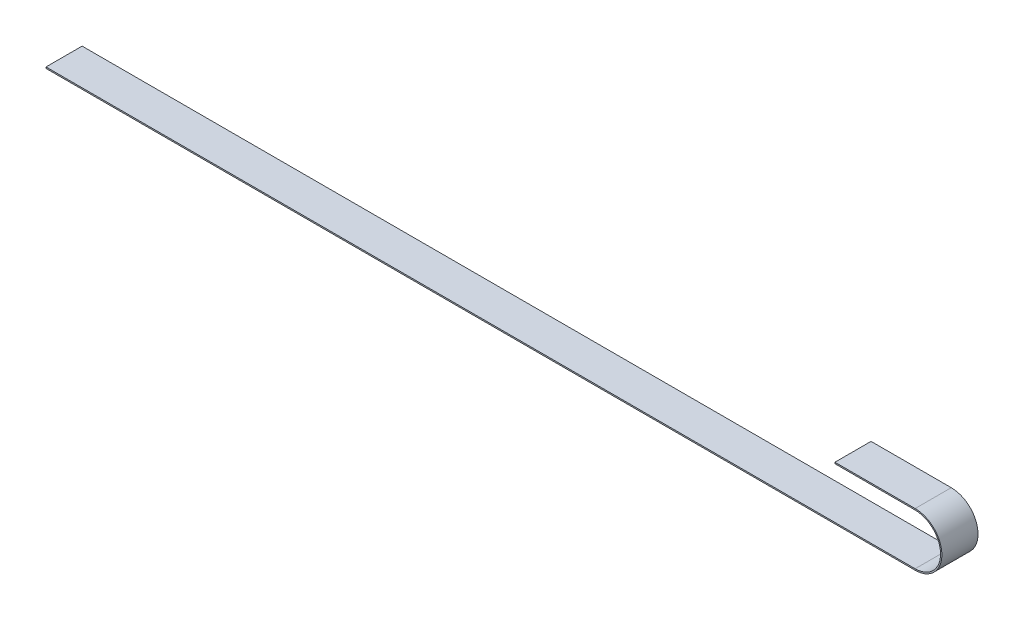
ISO-10303-21;
HEADER;
FILE_DESCRIPTION(('STEP AP214'),'2;1');
FILE_NAME('part.step','',(''),(''),'','','');
FILE_SCHEMA(('AUTOMOTIVE_DESIGN { 1 0 10303 214 1 1 1 1 }'));
ENDSEC;
DATA;
#1=APPLICATION_CONTEXT('core data for automotive mechanical design processes');
#2=APPLICATION_PROTOCOL_DEFINITION('international standard','automotive_design',2000,#1);
#3=PRODUCT_CONTEXT('',#1,'mechanical');
#4=PRODUCT('Part','Part','',(#3));
#5=PRODUCT_RELATED_PRODUCT_CATEGORY('part','',(#4));
#6=PRODUCT_DEFINITION_FORMATION('','',#4);
#7=PRODUCT_DEFINITION_CONTEXT('part definition',#1,'design');
#8=PRODUCT_DEFINITION('design','',#6,#7);
#9=PRODUCT_DEFINITION_SHAPE('','',#8);
#10=(LENGTH_UNIT() NAMED_UNIT(*) SI_UNIT(.MILLI.,.METRE.));
#11=(NAMED_UNIT(*) PLANE_ANGLE_UNIT() SI_UNIT($,.RADIAN.));
#12=(NAMED_UNIT(*) SI_UNIT($,.STERADIAN.) SOLID_ANGLE_UNIT());
#13=UNCERTAINTY_MEASURE_WITH_UNIT(LENGTH_MEASURE(1.E-05),#10,'distance_accuracy_value','');
#14=(GEOMETRIC_REPRESENTATION_CONTEXT(3) GLOBAL_UNCERTAINTY_ASSIGNED_CONTEXT((#13)) GLOBAL_UNIT_ASSIGNED_CONTEXT((#10,
#11,#12)) REPRESENTATION_CONTEXT('',''));
#15=CARTESIAN_POINT('',(0.,0.,0.));
#16=DIRECTION('',(0.,0.,1.));
#17=DIRECTION('',(1.,0.,0.));
#18=AXIS2_PLACEMENT_3D('',#15,#16,#17);
#19=CARTESIAN_POINT('',(650.,40.,13.5));
#20=DIRECTION('',(0.,-1.,0.));
#21=DIRECTION('',(1.,0.,0.));
#22=AXIS2_PLACEMENT_3D('',#19,#20,#21);
#23=PLANE('',#22);
#24=DIRECTION('',(-1.,0.,0.));
#25=VECTOR('',#24,1.);
#26=CARTESIAN_POINT('',(650.,40.,-13.5));
#27=LINE('',#26,#25);
#28=CARTESIAN_POINT('',(650.,40.,-13.5));
#29=VERTEX_POINT('',#28);
#30=CARTESIAN_POINT('',(590.,40.,-13.5));
#31=VERTEX_POINT('',#30);
#32=EDGE_CURVE('E132',#29,#31,#27,.T.);
#33=ORIENTED_EDGE('',*,*,#32,.T.);
#34=DIRECTION('',(0.,0.,-1.));
#35=VECTOR('',#34,1.);
#36=CARTESIAN_POINT('',(590.,40.,13.5));
#37=LINE('',#36,#35);
#38=CARTESIAN_POINT('',(590.,40.,13.5));
#39=VERTEX_POINT('',#38);
#40=EDGE_CURVE('E11',#39,#31,#37,.T.);
#41=ORIENTED_EDGE('',*,*,#40,.F.);
#42=DIRECTION('',(-1.,0.,0.));
#43=VECTOR('',#42,1.);
#44=CARTESIAN_POINT('',(650.,40.,13.5));
#45=LINE('',#44,#43);
#46=CARTESIAN_POINT('',(650.,40.,13.5));
#47=VERTEX_POINT('',#46);
#48=EDGE_CURVE('E90',#47,#39,#45,.T.);
#49=ORIENTED_EDGE('',*,*,#48,.F.);
#50=DIRECTION('',(0.,0.,-1.));
#51=VECTOR('',#50,1.);
#52=CARTESIAN_POINT('',(650.,40.,13.5));
#53=LINE('',#52,#51);
#54=EDGE_CURVE('E131',#47,#29,#53,.T.);
#55=ORIENTED_EDGE('',*,*,#54,.T.);
#56=EDGE_LOOP('',(#33,#41,#49,#55));
#57=FACE_BOUND('',#56,.T.);
#58=ADVANCED_FACE('F35',(#57),#23,.F.);
#59=CARTESIAN_POINT('',(590.,39.,13.5));
#60=DIRECTION('',(-1.,0.,0.));
#61=DIRECTION('',(0.,0.,1.));
#62=AXIS2_PLACEMENT_3D('',#59,#60,#61);
#63=PLANE('',#62);
#64=DIRECTION('',(0.,1.,0.));
#65=VECTOR('',#64,1.);
#66=CARTESIAN_POINT('',(590.,39.,-13.5));
#67=LINE('',#66,#65);
#68=CARTESIAN_POINT('',(590.,39.,-13.5));
#69=VERTEX_POINT('',#68);
#70=EDGE_CURVE('E135',#69,#31,#67,.T.);
#71=ORIENTED_EDGE('',*,*,#70,.F.);
#72=DIRECTION('',(0.,0.,-1.));
#73=VECTOR('',#72,1.);
#74=CARTESIAN_POINT('',(590.,39.,13.5));
#75=LINE('',#74,#73);
#76=CARTESIAN_POINT('',(590.,39.,13.5));
#77=VERTEX_POINT('',#76);
#78=EDGE_CURVE('E43',#77,#69,#75,.T.);
#79=ORIENTED_EDGE('',*,*,#78,.F.);
#80=DIRECTION('',(0.,1.,0.));
#81=VECTOR('',#80,1.);
#82=CARTESIAN_POINT('',(590.,39.,13.5));
#83=LINE('',#82,#81);
#84=EDGE_CURVE('E174',#77,#39,#83,.T.);
#85=ORIENTED_EDGE('',*,*,#84,.T.);
#86=ORIENTED_EDGE('',*,*,#40,.T.);
#87=EDGE_LOOP('',(#71,#79,#85,#86));
#88=FACE_BOUND('',#87,.T.);
#89=ADVANCED_FACE('F165',(#88),#63,.T.);
#90=CARTESIAN_POINT('',(650.,39.,13.5));
#91=DIRECTION('',(0.,-1.,0.));
#92=DIRECTION('',(1.,0.,0.));
#93=AXIS2_PLACEMENT_3D('',#90,#91,#92);
#94=PLANE('',#93);
#95=DIRECTION('',(-1.,0.,0.));
#96=VECTOR('',#95,1.);
#97=CARTESIAN_POINT('',(650.,39.,-13.5));
#98=LINE('',#97,#96);
#99=CARTESIAN_POINT('',(650.,39.,-13.5));
#100=VERTEX_POINT('',#99);
#101=EDGE_CURVE('E138',#100,#69,#98,.T.);
#102=ORIENTED_EDGE('',*,*,#101,.F.);
#103=DIRECTION('',(0.,0.,-1.));
#104=VECTOR('',#103,1.);
#105=CARTESIAN_POINT('',(650.,39.,13.5));
#106=LINE('',#105,#104);
#107=CARTESIAN_POINT('',(650.,39.,13.5));
#108=VERTEX_POINT('',#107);
#109=EDGE_CURVE('E155',#108,#100,#106,.T.);
#110=ORIENTED_EDGE('',*,*,#109,.F.);
#111=DIRECTION('',(-1.,0.,0.));
#112=VECTOR('',#111,1.);
#113=CARTESIAN_POINT('',(650.,39.,13.5));
#114=LINE('',#113,#112);
#115=EDGE_CURVE('E162',#108,#77,#114,.T.);
#116=ORIENTED_EDGE('',*,*,#115,.T.);
#117=ORIENTED_EDGE('',*,*,#78,.T.);
#118=EDGE_LOOP('',(#102,#110,#116,#117));
#119=FACE_BOUND('',#118,.T.);
#120=ADVANCED_FACE('F160',(#119),#94,.T.);
#121=CARTESIAN_POINT('',(650.,20.,13.5));
#122=DIRECTION('',(0.,0.,-1.));
#123=DIRECTION('',(-1.,0.,0.));
#124=AXIS2_PLACEMENT_3D('',#121,#122,#123);
#125=CYLINDRICAL_SURFACE('',#124,19.);
#126=CARTESIAN_POINT('',(650.,20.,-13.5));
#127=DIRECTION('',(0.,0.,1.));
#128=DIRECTION('',(1.,0.,0.));
#129=AXIS2_PLACEMENT_3D('',#126,#127,#128);
#130=CIRCLE('',#129,19.);
#131=CARTESIAN_POINT('',(650.,1.,-13.5));
#132=VERTEX_POINT('',#131);
#133=EDGE_CURVE('E141',#132,#100,#130,.T.);
#134=ORIENTED_EDGE('',*,*,#133,.F.);
#135=DIRECTION('',(0.,0.,-1.));
#136=VECTOR('',#135,1.);
#137=CARTESIAN_POINT('',(650.,1.,13.5));
#138=LINE('',#137,#136);
#139=CARTESIAN_POINT('',(650.,1.,13.5));
#140=VERTEX_POINT('',#139);
#141=EDGE_CURVE('E153',#140,#132,#138,.T.);
#142=ORIENTED_EDGE('',*,*,#141,.F.);
#143=CARTESIAN_POINT('',(650.,20.,13.5));
#144=DIRECTION('',(0.,0.,1.));
#145=DIRECTION('',(1.,0.,0.));
#146=AXIS2_PLACEMENT_3D('',#143,#144,#145);
#147=CIRCLE('',#146,19.);
#148=EDGE_CURVE('E126',#140,#108,#147,.T.);
#149=ORIENTED_EDGE('',*,*,#148,.T.);
#150=ORIENTED_EDGE('',*,*,#109,.T.);
#151=EDGE_LOOP('',(#134,#142,#149,#150));
#152=FACE_BOUND('',#151,.T.);
#153=ADVANCED_FACE('F172',(#152),#125,.F.);
#154=CARTESIAN_POINT('',(0.,1.,13.5));
#155=DIRECTION('',(0.,1.,0.));
#156=DIRECTION('',(0.,0.,1.));
#157=AXIS2_PLACEMENT_3D('',#154,#155,#156);
#158=PLANE('',#157);
#159=DIRECTION('',(1.,0.,0.));
#160=VECTOR('',#159,1.);
#161=CARTESIAN_POINT('',(0.,1.,-13.5));
#162=LINE('',#161,#160);
#163=CARTESIAN_POINT('',(0.,1.,-13.5));
#164=VERTEX_POINT('',#163);
#165=EDGE_CURVE('E144',#164,#132,#162,.T.);
#166=ORIENTED_EDGE('',*,*,#165,.F.);
#167=DIRECTION('',(0.,0.,-1.));
#168=VECTOR('',#167,1.);
#169=CARTESIAN_POINT('',(0.,1.,13.5));
#170=LINE('',#169,#168);
#171=CARTESIAN_POINT('',(0.,1.,13.5));
#172=VERTEX_POINT('',#171);
#173=EDGE_CURVE('E114',#172,#164,#170,.T.);
#174=ORIENTED_EDGE('',*,*,#173,.F.);
#175=DIRECTION('',(1.,0.,0.));
#176=VECTOR('',#175,1.);
#177=CARTESIAN_POINT('',(0.,1.,13.5));
#178=LINE('',#177,#176);
#179=EDGE_CURVE('E124',#172,#140,#178,.T.);
#180=ORIENTED_EDGE('',*,*,#179,.T.);
#181=ORIENTED_EDGE('',*,*,#141,.T.);
#182=EDGE_LOOP('',(#166,#174,#180,#181));
#183=FACE_BOUND('',#182,.T.);
#184=ADVANCED_FACE('F179',(#183),#158,.T.);
#185=CARTESIAN_POINT('',(0.,0.,13.5));
#186=DIRECTION('',(-1.,0.,0.));
#187=DIRECTION('',(0.,0.,1.));
#188=AXIS2_PLACEMENT_3D('',#185,#186,#187);
#189=PLANE('',#188);
#190=DIRECTION('',(0.,1.,0.));
#191=VECTOR('',#190,1.);
#192=CARTESIAN_POINT('',(0.,0.,-13.5));
#193=LINE('',#192,#191);
#194=CARTESIAN_POINT('',(0.,0.,-13.5));
#195=VERTEX_POINT('',#194);
#196=EDGE_CURVE('E113',#195,#164,#193,.T.);
#197=ORIENTED_EDGE('',*,*,#196,.F.);
#198=DIRECTION('',(0.,0.,-1.));
#199=VECTOR('',#198,1.);
#200=CARTESIAN_POINT('',(0.,0.,13.5));
#201=LINE('',#200,#199);
#202=CARTESIAN_POINT('',(0.,0.,13.5));
#203=VERTEX_POINT('',#202);
#204=EDGE_CURVE('E107',#203,#195,#201,.T.);
#205=ORIENTED_EDGE('',*,*,#204,.F.);
#206=DIRECTION('',(0.,1.,0.));
#207=VECTOR('',#206,1.);
#208=CARTESIAN_POINT('',(0.,0.,13.5));
#209=LINE('',#208,#207);
#210=EDGE_CURVE('E111',#203,#172,#209,.T.);
#211=ORIENTED_EDGE('',*,*,#210,.T.);
#212=ORIENTED_EDGE('',*,*,#173,.T.);
#213=EDGE_LOOP('',(#197,#205,#211,#212));
#214=FACE_BOUND('',#213,.T.);
#215=ADVANCED_FACE('F109',(#214),#189,.T.);
#216=CARTESIAN_POINT('',(0.,0.,13.5));
#217=DIRECTION('',(0.,1.,0.));
#218=DIRECTION('',(0.,0.,1.));
#219=AXIS2_PLACEMENT_3D('',#216,#217,#218);
#220=PLANE('',#219);
#221=DIRECTION('',(1.,0.,0.));
#222=VECTOR('',#221,1.);
#223=CARTESIAN_POINT('',(0.,0.,-13.5));
#224=LINE('',#223,#222);
#225=CARTESIAN_POINT('',(650.,0.,-13.5));
#226=VERTEX_POINT('',#225);
#227=EDGE_CURVE('E78',#195,#226,#224,.T.);
#228=ORIENTED_EDGE('',*,*,#227,.T.);
#229=DIRECTION('',(0.,0.,-1.));
#230=VECTOR('',#229,1.);
#231=CARTESIAN_POINT('',(650.,0.,13.5));
#232=LINE('',#231,#230);
#233=CARTESIAN_POINT('',(650.,0.,13.5));
#234=VERTEX_POINT('',#233);
#235=EDGE_CURVE('E115',#234,#226,#232,.T.);
#236=ORIENTED_EDGE('',*,*,#235,.F.);
#237=DIRECTION('',(1.,0.,0.));
#238=VECTOR('',#237,1.);
#239=CARTESIAN_POINT('',(0.,0.,13.5));
#240=LINE('',#239,#238);
#241=EDGE_CURVE('E117',#203,#234,#240,.T.);
#242=ORIENTED_EDGE('',*,*,#241,.F.);
#243=ORIENTED_EDGE('',*,*,#204,.T.);
#244=EDGE_LOOP('',(#228,#236,#242,#243));
#245=FACE_BOUND('',#244,.T.);
#246=ADVANCED_FACE('F118',(#245),#220,.F.);
#247=CARTESIAN_POINT('',(650.,20.,13.5));
#248=DIRECTION('',(0.,0.,-1.));
#249=DIRECTION('',(-1.,0.,0.));
#250=AXIS2_PLACEMENT_3D('',#247,#248,#249);
#251=CYLINDRICAL_SURFACE('',#250,20.);
#252=CARTESIAN_POINT('',(650.,20.,-13.5));
#253=DIRECTION('',(0.,0.,1.));
#254=DIRECTION('',(1.,0.,0.));
#255=AXIS2_PLACEMENT_3D('',#252,#253,#254);
#256=CIRCLE('',#255,20.);
#257=EDGE_CURVE('E84',#226,#29,#256,.T.);
#258=ORIENTED_EDGE('',*,*,#257,.T.);
#259=ORIENTED_EDGE('',*,*,#54,.F.);
#260=CARTESIAN_POINT('',(650.,20.,13.5));
#261=DIRECTION('',(0.,0.,1.));
#262=DIRECTION('',(1.,0.,0.));
#263=AXIS2_PLACEMENT_3D('',#260,#261,#262);
#264=CIRCLE('',#263,20.);
#265=EDGE_CURVE('E51',#234,#47,#264,.T.);
#266=ORIENTED_EDGE('',*,*,#265,.F.);
#267=ORIENTED_EDGE('',*,*,#235,.T.);
#268=EDGE_LOOP('',(#258,#259,#266,#267));
#269=FACE_BOUND('',#268,.T.);
#270=ADVANCED_FACE('F181',(#269),#251,.T.);
#271=CARTESIAN_POINT('',(650.,20.,13.5));
#272=DIRECTION('',(0.,0.,1.));
#273=DIRECTION('',(1.,0.,0.));
#274=AXIS2_PLACEMENT_3D('',#271,#272,#273);
#275=PLANE('',#274);
#276=ORIENTED_EDGE('',*,*,#48,.T.);
#277=ORIENTED_EDGE('',*,*,#84,.F.);
#278=ORIENTED_EDGE('',*,*,#115,.F.);
#279=ORIENTED_EDGE('',*,*,#148,.F.);
#280=ORIENTED_EDGE('',*,*,#179,.F.);
#281=ORIENTED_EDGE('',*,*,#210,.F.);
#282=ORIENTED_EDGE('',*,*,#241,.T.);
#283=ORIENTED_EDGE('',*,*,#265,.T.);
#284=EDGE_LOOP('',(#276,#277,#278,#279,#280,#281,#282,#283));
#285=FACE_BOUND('',#284,.T.);
#286=ADVANCED_FACE('F121',(#285),#275,.T.);
#287=CARTESIAN_POINT('',(650.,20.,-13.5));
#288=DIRECTION('',(0.,0.,1.));
#289=DIRECTION('',(1.,0.,0.));
#290=AXIS2_PLACEMENT_3D('',#287,#288,#289);
#291=PLANE('',#290);
#292=ORIENTED_EDGE('',*,*,#32,.F.);
#293=ORIENTED_EDGE('',*,*,#257,.F.);
#294=ORIENTED_EDGE('',*,*,#227,.F.);
#295=ORIENTED_EDGE('',*,*,#196,.T.);
#296=ORIENTED_EDGE('',*,*,#165,.T.);
#297=ORIENTED_EDGE('',*,*,#133,.T.);
#298=ORIENTED_EDGE('',*,*,#101,.T.);
#299=ORIENTED_EDGE('',*,*,#70,.T.);
#300=EDGE_LOOP('',(#292,#293,#294,#295,#296,#297,#298,#299));
#301=FACE_BOUND('',#300,.T.);
#302=ADVANCED_FACE('F168',(#301),#291,.F.);
#303=CLOSED_SHELL('',(#58,#89,#120,#153,#184,#215,#246,#270,#286,#302));
#304=MANIFOLD_SOLID_BREP('B2',#303);
#305=ADVANCED_BREP_SHAPE_REPRESENTATION('',(#18,#304),#14);
#306=SHAPE_DEFINITION_REPRESENTATION(#9,#305);
ENDSEC;
END-ISO-10303-21;
